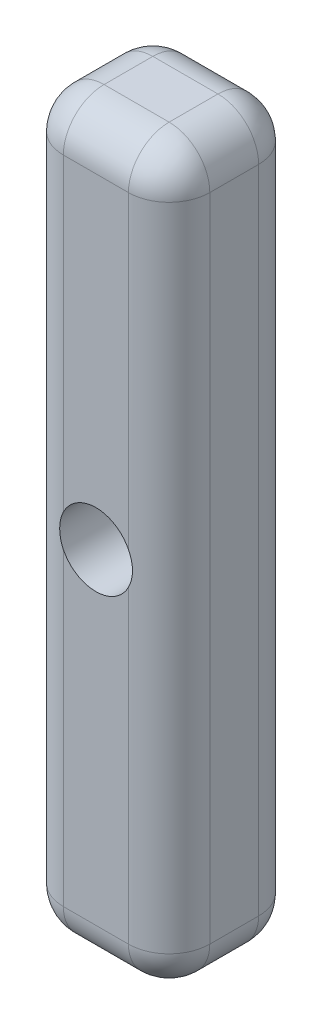
ISO-10303-21;
HEADER;
FILE_DESCRIPTION(('STEP AP214'),'2;1');
FILE_NAME('part.step','',(''),(''),'','','');
FILE_SCHEMA(('AUTOMOTIVE_DESIGN { 1 0 10303 214 1 1 1 1 }'));
ENDSEC;
DATA;
#1=APPLICATION_CONTEXT('core data for automotive mechanical design processes');
#2=APPLICATION_PROTOCOL_DEFINITION('international standard','automotive_design',2000,#1);
#3=PRODUCT_CONTEXT('',#1,'mechanical');
#4=PRODUCT('Part','Part','',(#3));
#5=PRODUCT_RELATED_PRODUCT_CATEGORY('part','',(#4));
#6=PRODUCT_DEFINITION_FORMATION('','',#4);
#7=PRODUCT_DEFINITION_CONTEXT('part definition',#1,'design');
#8=PRODUCT_DEFINITION('design','',#6,#7);
#9=PRODUCT_DEFINITION_SHAPE('','',#8);
#10=(LENGTH_UNIT() NAMED_UNIT(*) SI_UNIT(.MILLI.,.METRE.));
#11=(NAMED_UNIT(*) PLANE_ANGLE_UNIT() SI_UNIT($,.RADIAN.));
#12=(NAMED_UNIT(*) SI_UNIT($,.STERADIAN.) SOLID_ANGLE_UNIT());
#13=UNCERTAINTY_MEASURE_WITH_UNIT(LENGTH_MEASURE(1.E-05),#10,'distance_accuracy_value','');
#14=(GEOMETRIC_REPRESENTATION_CONTEXT(3) GLOBAL_UNCERTAINTY_ASSIGNED_CONTEXT((#13)) GLOBAL_UNIT_ASSIGNED_CONTEXT((#10,
#11,#12)) REPRESENTATION_CONTEXT('',''));
#15=CARTESIAN_POINT('',(0.,0.,0.));
#16=DIRECTION('',(0.,0.,1.));
#17=DIRECTION('',(1.,0.,0.));
#18=AXIS2_PLACEMENT_3D('',#15,#16,#17);
#19=CARTESIAN_POINT('',(0.,0.,16.));
#20=DIRECTION('',(0.,0.,-1.));
#21=DIRECTION('',(-1.,0.,0.));
#22=AXIS2_PLACEMENT_3D('',#19,#20,#21);
#23=PLANE('',#22);
#24=DIRECTION('',(-1.,0.,0.));
#25=VECTOR('',#24,1.);
#26=CARTESIAN_POINT('',(0.,40.,16.));
#27=LINE('',#26,#25);
#28=CARTESIAN_POINT('',(4.,40.,16.));
#29=VERTEX_POINT('',#28);
#30=CARTESIAN_POINT('',(-4.,40.,16.));
#31=VERTEX_POINT('',#30);
#32=EDGE_CURVE('E166',#29,#31,#27,.T.);
#33=ORIENTED_EDGE('',*,*,#32,.T.);
#34=DIRECTION('',(0.,-1.,0.));
#35=VECTOR('',#34,1.);
#36=CARTESIAN_POINT('',(-4.,0.,16.));
#37=LINE('',#36,#35);
#38=CARTESIAN_POINT('',(-4.,2.00639602272334,16.));
#39=VERTEX_POINT('',#38);
#40=EDGE_CURVE('E154',#31,#39,#37,.T.);
#41=ORIENTED_EDGE('',*,*,#40,.T.);
#42=CARTESIAN_POINT('',(0.,0.,16.));
#43=DIRECTION('',(0.,0.,1.));
#44=DIRECTION('',(1.,0.,0.));
#45=AXIS2_PLACEMENT_3D('',#42,#43,#44);
#46=CIRCLE('',#45,4.475);
#47=CARTESIAN_POINT('',(4.,2.00639602272333,16.));
#48=VERTEX_POINT('',#47);
#49=EDGE_CURVE('E148',#48,#39,#46,.T.);
#50=ORIENTED_EDGE('',*,*,#49,.F.);
#51=DIRECTION('',(0.,1.,0.));
#52=VECTOR('',#51,1.);
#53=CARTESIAN_POINT('',(4.,0.,16.));
#54=LINE('',#53,#52);
#55=EDGE_CURVE('E160',#48,#29,#54,.T.);
#56=ORIENTED_EDGE('',*,*,#55,.T.);
#57=EDGE_LOOP('',(#33,#41,#50,#56));
#58=FACE_BOUND('',#57,.T.);
#59=ADVANCED_FACE('F41',(#58),#23,.F.);
#60=CARTESIAN_POINT('',(9.,45.,16.));
#61=DIRECTION('',(0.,-1.,0.));
#62=DIRECTION('',(0.,0.,-1.));
#63=AXIS2_PLACEMENT_3D('',#60,#61,#62);
#64=PLANE('',#63);
#65=DIRECTION('',(-1.,0.,0.));
#66=VECTOR('',#65,1.);
#67=CARTESIAN_POINT('',(9.,45.,11.));
#68=LINE('',#67,#66);
#69=CARTESIAN_POINT('',(-4.,45.,11.));
#70=VERTEX_POINT('',#69);
#71=CARTESIAN_POINT('',(4.,45.,11.));
#72=VERTEX_POINT('',#71);
#73=EDGE_CURVE('E474',#70,#72,#68,.F.);
#74=ORIENTED_EDGE('',*,*,#73,.T.);
#75=DIRECTION('',(0.,0.,-1.));
#76=VECTOR('',#75,1.);
#77=CARTESIAN_POINT('',(4.,45.,16.));
#78=LINE('',#77,#76);
#79=CARTESIAN_POINT('',(4.,45.,5.));
#80=VERTEX_POINT('',#79);
#81=EDGE_CURVE('E464',#72,#80,#78,.T.);
#82=ORIENTED_EDGE('',*,*,#81,.T.);
#83=DIRECTION('',(-1.,0.,0.));
#84=VECTOR('',#83,1.);
#85=CARTESIAN_POINT('',(-9.,45.,5.));
#86=LINE('',#85,#84);
#87=CARTESIAN_POINT('',(-4.,45.,5.));
#88=VERTEX_POINT('',#87);
#89=EDGE_CURVE('E473',#80,#88,#86,.T.);
#90=ORIENTED_EDGE('',*,*,#89,.T.);
#91=DIRECTION('',(0.,0.,-1.));
#92=VECTOR('',#91,1.);
#93=CARTESIAN_POINT('',(-4.,45.,16.));
#94=LINE('',#93,#92);
#95=EDGE_CURVE('E476',#88,#70,#94,.F.);
#96=ORIENTED_EDGE('',*,*,#95,.T.);
#97=EDGE_LOOP('',(#74,#82,#90,#96));
#98=FACE_BOUND('',#97,.T.);
#99=ADVANCED_FACE('F212',(#98),#64,.F.);
#100=CARTESIAN_POINT('',(-9.,-45.,16.));
#101=DIRECTION('',(1.,0.,0.));
#102=DIRECTION('',(0.,0.,-1.));
#103=AXIS2_PLACEMENT_3D('',#100,#101,#102);
#104=PLANE('',#103);
#105=DIRECTION('',(0.,0.,-1.));
#106=VECTOR('',#105,1.);
#107=CARTESIAN_POINT('',(-9.,-40.,16.));
#108=LINE('',#107,#106);
#109=CARTESIAN_POINT('',(-9.,-40.,5.));
#110=VERTEX_POINT('',#109);
#111=CARTESIAN_POINT('',(-9.,-40.,11.));
#112=VERTEX_POINT('',#111);
#113=EDGE_CURVE('E582',#110,#112,#108,.F.);
#114=ORIENTED_EDGE('',*,*,#113,.T.);
#115=DIRECTION('',(0.,-1.,0.));
#116=VECTOR('',#115,1.);
#117=CARTESIAN_POINT('',(-9.,-45.,11.));
#118=LINE('',#117,#116);
#119=CARTESIAN_POINT('',(-9.,40.,11.));
#120=VERTEX_POINT('',#119);
#121=EDGE_CURVE('E562',#112,#120,#118,.F.);
#122=ORIENTED_EDGE('',*,*,#121,.T.);
#123=DIRECTION('',(0.,0.,-1.));
#124=VECTOR('',#123,1.);
#125=CARTESIAN_POINT('',(-9.,40.,16.));
#126=LINE('',#125,#124);
#127=CARTESIAN_POINT('',(-9.,40.,5.));
#128=VERTEX_POINT('',#127);
#129=EDGE_CURVE('E570',#120,#128,#126,.T.);
#130=ORIENTED_EDGE('',*,*,#129,.T.);
#131=DIRECTION('',(0.,-1.,0.));
#132=VECTOR('',#131,1.);
#133=CARTESIAN_POINT('',(-9.,-45.,5.));
#134=LINE('',#133,#132);
#135=EDGE_CURVE('E571',#128,#110,#134,.T.);
#136=ORIENTED_EDGE('',*,*,#135,.T.);
#137=EDGE_LOOP('',(#114,#122,#130,#136));
#138=FACE_BOUND('',#137,.T.);
#139=ADVANCED_FACE('F215',(#138),#104,.F.);
#140=CARTESIAN_POINT('',(9.,-45.,16.));
#141=DIRECTION('',(0.,1.,0.));
#142=DIRECTION('',(0.,0.,1.));
#143=AXIS2_PLACEMENT_3D('',#140,#141,#142);
#144=PLANE('',#143);
#145=DIRECTION('',(1.,0.,0.));
#146=VECTOR('',#145,1.);
#147=CARTESIAN_POINT('',(9.,-45.,11.));
#148=LINE('',#147,#146);
#149=CARTESIAN_POINT('',(4.,-45.,11.));
#150=VERTEX_POINT('',#149);
#151=CARTESIAN_POINT('',(-4.,-45.,11.));
#152=VERTEX_POINT('',#151);
#153=EDGE_CURVE('E49',#150,#152,#148,.F.);
#154=ORIENTED_EDGE('',*,*,#153,.T.);
#155=DIRECTION('',(0.,0.,-1.));
#156=VECTOR('',#155,1.);
#157=CARTESIAN_POINT('',(-4.,-45.,16.));
#158=LINE('',#157,#156);
#159=CARTESIAN_POINT('',(-4.,-45.,5.));
#160=VERTEX_POINT('',#159);
#161=EDGE_CURVE('E11',#152,#160,#158,.T.);
#162=ORIENTED_EDGE('',*,*,#161,.T.);
#163=DIRECTION('',(1.,0.,0.));
#164=VECTOR('',#163,1.);
#165=CARTESIAN_POINT('',(9.,-45.,5.));
#166=LINE('',#165,#164);
#167=CARTESIAN_POINT('',(4.,-45.,5.));
#168=VERTEX_POINT('',#167);
#169=EDGE_CURVE('E490',#160,#168,#166,.T.);
#170=ORIENTED_EDGE('',*,*,#169,.T.);
#171=DIRECTION('',(0.,0.,-1.));
#172=VECTOR('',#171,1.);
#173=CARTESIAN_POINT('',(4.,-45.,16.));
#174=LINE('',#173,#172);
#175=EDGE_CURVE('E63',#168,#150,#174,.F.);
#176=ORIENTED_EDGE('',*,*,#175,.T.);
#177=EDGE_LOOP('',(#154,#162,#170,#176));
#178=FACE_BOUND('',#177,.T.);
#179=ADVANCED_FACE('F206',(#178),#144,.F.);
#180=CARTESIAN_POINT('',(9.,-45.,16.));
#181=DIRECTION('',(-1.,0.,0.));
#182=DIRECTION('',(0.,0.,1.));
#183=AXIS2_PLACEMENT_3D('',#180,#181,#182);
#184=PLANE('',#183);
#185=DIRECTION('',(0.,0.,-1.));
#186=VECTOR('',#185,1.);
#187=CARTESIAN_POINT('',(9.,40.,16.));
#188=LINE('',#187,#186);
#189=CARTESIAN_POINT('',(9.,40.,5.));
#190=VERTEX_POINT('',#189);
#191=CARTESIAN_POINT('',(9.,40.,11.));
#192=VERTEX_POINT('',#191);
#193=EDGE_CURVE('E463',#190,#192,#188,.F.);
#194=ORIENTED_EDGE('',*,*,#193,.T.);
#195=DIRECTION('',(0.,1.,0.));
#196=VECTOR('',#195,1.);
#197=CARTESIAN_POINT('',(9.,-45.,11.));
#198=LINE('',#197,#196);
#199=CARTESIAN_POINT('',(9.,-40.,11.));
#200=VERTEX_POINT('',#199);
#201=EDGE_CURVE('E580',#192,#200,#198,.F.);
#202=ORIENTED_EDGE('',*,*,#201,.T.);
#203=DIRECTION('',(0.,0.,-1.));
#204=VECTOR('',#203,1.);
#205=CARTESIAN_POINT('',(9.,-40.,16.));
#206=LINE('',#205,#204);
#207=CARTESIAN_POINT('',(9.,-40.,5.));
#208=VERTEX_POINT('',#207);
#209=EDGE_CURVE('E566',#200,#208,#206,.T.);
#210=ORIENTED_EDGE('',*,*,#209,.T.);
#211=DIRECTION('',(0.,1.,0.));
#212=VECTOR('',#211,1.);
#213=CARTESIAN_POINT('',(9.,45.,5.));
#214=LINE('',#213,#212);
#215=EDGE_CURVE('E567',#208,#190,#214,.T.);
#216=ORIENTED_EDGE('',*,*,#215,.T.);
#217=EDGE_LOOP('',(#194,#202,#210,#216));
#218=FACE_BOUND('',#217,.T.);
#219=ADVANCED_FACE('F202',(#218),#184,.F.);
#220=CARTESIAN_POINT('',(-4.,-2.00639602272334,16.));
#221=VERTEX_POINT('',#220);
#222=CARTESIAN_POINT('',(4.,-2.00639602272333,16.));
#223=VERTEX_POINT('',#222);
#224=EDGE_CURVE('E146',#221,#223,#46,.T.);
#225=ORIENTED_EDGE('',*,*,#224,.F.);
#226=DIRECTION('',(0.,-1.,0.));
#227=VECTOR('',#226,1.);
#228=CARTESIAN_POINT('',(-4.,0.,16.));
#229=LINE('',#228,#227);
#230=CARTESIAN_POINT('',(-4.,-40.,16.));
#231=VERTEX_POINT('',#230);
#232=EDGE_CURVE('E171',#221,#231,#229,.T.);
#233=ORIENTED_EDGE('',*,*,#232,.T.);
#234=DIRECTION('',(1.,0.,0.));
#235=VECTOR('',#234,1.);
#236=CARTESIAN_POINT('',(0.,-40.,16.));
#237=LINE('',#236,#235);
#238=CARTESIAN_POINT('',(4.,-40.,16.));
#239=VERTEX_POINT('',#238);
#240=EDGE_CURVE('E551',#231,#239,#237,.T.);
#241=ORIENTED_EDGE('',*,*,#240,.T.);
#242=DIRECTION('',(0.,1.,0.));
#243=VECTOR('',#242,1.);
#244=CARTESIAN_POINT('',(4.,0.,16.));
#245=LINE('',#244,#243);
#246=EDGE_CURVE('E554',#239,#223,#245,.T.);
#247=ORIENTED_EDGE('',*,*,#246,.T.);
#248=EDGE_LOOP('',(#225,#233,#241,#247));
#249=FACE_BOUND('',#248,.T.);
#250=ADVANCED_FACE('F200',(#249),#23,.F.);
#251=CARTESIAN_POINT('',(0.,0.,0.));
#252=DIRECTION('',(0.,0.,-1.));
#253=DIRECTION('',(-1.,0.,0.));
#254=AXIS2_PLACEMENT_3D('',#251,#252,#253);
#255=PLANE('',#254);
#256=DIRECTION('',(0.,-1.,0.));
#257=VECTOR('',#256,1.);
#258=CARTESIAN_POINT('',(-4.,45.,0.));
#259=LINE('',#258,#257);
#260=CARTESIAN_POINT('',(-4.,-40.,0.));
#261=VERTEX_POINT('',#260);
#262=CARTESIAN_POINT('',(-4.,40.,0.));
#263=VERTEX_POINT('',#262);
#264=EDGE_CURVE('E481',#261,#263,#259,.F.);
#265=ORIENTED_EDGE('',*,*,#264,.T.);
#266=DIRECTION('',(-1.,0.,0.));
#267=VECTOR('',#266,1.);
#268=CARTESIAN_POINT('',(9.,40.,0.));
#269=LINE('',#268,#267);
#270=CARTESIAN_POINT('',(4.,40.,0.));
#271=VERTEX_POINT('',#270);
#272=EDGE_CURVE('E487',#263,#271,#269,.F.);
#273=ORIENTED_EDGE('',*,*,#272,.T.);
#274=DIRECTION('',(0.,1.,0.));
#275=VECTOR('',#274,1.);
#276=CARTESIAN_POINT('',(4.,-45.,0.));
#277=LINE('',#276,#275);
#278=CARTESIAN_POINT('',(4.,-40.,0.));
#279=VERTEX_POINT('',#278);
#280=EDGE_CURVE('E480',#271,#279,#277,.F.);
#281=ORIENTED_EDGE('',*,*,#280,.T.);
#282=DIRECTION('',(1.,0.,0.));
#283=VECTOR('',#282,1.);
#284=CARTESIAN_POINT('',(-9.,-40.,0.));
#285=LINE('',#284,#283);
#286=EDGE_CURVE('E472',#279,#261,#285,.F.);
#287=ORIENTED_EDGE('',*,*,#286,.T.);
#288=EDGE_LOOP('',(#265,#273,#281,#287));
#289=FACE_BOUND('',#288,.T.);
#290=ADVANCED_FACE('F192',(#289),#255,.T.);
#291=CARTESIAN_POINT('',(0.,0.,3.3));
#292=DIRECTION('',(0.,0.,1.));
#293=DIRECTION('',(1.,0.,0.));
#294=AXIS2_PLACEMENT_3D('',#291,#292,#293);
#295=CYLINDRICAL_SURFACE('',#294,4.475);
#296=CARTESIAN_POINT('',(0.,0.,3.3));
#297=DIRECTION('',(0.,0.,1.));
#298=DIRECTION('',(1.,0.,0.));
#299=AXIS2_PLACEMENT_3D('',#296,#297,#298);
#300=CIRCLE('',#299,4.475);
#301=CARTESIAN_POINT('',(4.475,0.,3.3));
#302=VERTEX_POINT('',#301);
#303=EDGE_CURVE('E158',#302,#302,#300,.T.);
#304=ORIENTED_EDGE('',*,*,#303,.F.);
#305=EDGE_LOOP('',(#304));
#306=FACE_BOUND('',#305,.T.);
#307=ORIENTED_EDGE('',*,*,#49,.T.);
#308=CARTESIAN_POINT('',(-4.,2.00639602272334,16.));
#309=CARTESIAN_POINT('',(-4.05639728681269,1.89399038176476,15.9999751909253));
#310=CARTESIAN_POINT('',(-4.10802835517569,1.77920538537928,15.9990445828598));
#311=CARTESIAN_POINT('',(-4.20144793817522,1.5457162278286,15.9961654923754));
#312=CARTESIAN_POINT('',(-4.24323702026239,1.42701229306429,15.9942170686607));
#313=CARTESIAN_POINT('',(-4.31663393655196,1.18662677928175,15.9900978574479));
#314=CARTESIAN_POINT('',(-4.34825148029835,1.064948159968,15.9879272846341));
#315=CARTESIAN_POINT('',(-4.40114184862142,0.819359770278402,15.983953663564));
#316=CARTESIAN_POINT('',(-4.42241493262628,0.695450055936901,15.9821506060914));
#317=CARTESIAN_POINT('',(-4.45447755730899,0.446162721476656,15.9793281777453));
#318=CARTESIAN_POINT('',(-4.4652580280109,0.320783926024703,15.9783094850474));
#319=CARTESIAN_POINT('',(-4.47622571658609,0.0695600826896412,15.9772722841938));
#320=CARTESIAN_POINT('',(-4.47641284088471,-0.0562849693022512,15.9772537848731));
#321=CARTESIAN_POINT('',(-4.46619162977098,-0.307480465776451,15.978221935045));
#322=CARTESIAN_POINT('',(-4.45578885489134,-0.432831135172136,15.9792080570324));
#323=CARTESIAN_POINT('',(-4.42448697302121,-0.682158198945725,15.9819723183656));
#324=CARTESIAN_POINT('',(-4.40358959812081,-0.806134816655175,15.9837503270083));
#325=CARTESIAN_POINT('',(-4.33788403724872,-1.11567102962808,15.9887335535802));
#326=CARTESIAN_POINT('',(-4.28629690654538,-1.2998525039807,15.9922009077931));
#327=CARTESIAN_POINT('',(-4.1916793885092,-1.56989636891457,15.996421839261));
#328=CARTESIAN_POINT('',(-4.15726571604157,-1.65887631709816,15.9976654961414));
#329=CARTESIAN_POINT('',(-4.08281631112458,-1.83448140597862,15.9994521193985));
#330=CARTESIAN_POINT('',(-4.04277938564264,-1.92110604230406,15.999994936835));
#331=CARTESIAN_POINT('',(-4.,-2.00639602272334,16.));
#332=B_SPLINE_CURVE_WITH_KNOTS('',3,(#308,#309,#310,#311,#312,#313,#314,#315,#316,#317,#318,
#319,#320,#321,#322,#323,#324,#325,#326,#327,#328,#329,#330,#331),.UNSPECIFIED.,.F.,.F.,(4,2,2,
2,2,2,2,2,2,2,2,4),(0.,0.377152217937876,0.754282685420198,1.13105207618023,1.50781201747219,
1.88489734735669,2.26198600816473,2.63887676974772,3.01570534751076,3.58779987621884,
3.87386969184339,4.16000029214202),.UNSPECIFIED.);
#333=EDGE_CURVE('E155',#39,#221,#332,.T.);
#334=ORIENTED_EDGE('',*,*,#333,.T.);
#335=ORIENTED_EDGE('',*,*,#224,.T.);
#336=CARTESIAN_POINT('',(4.,-2.00639602272333,16.));
#337=CARTESIAN_POINT('',(4.05639728681269,-1.89399038176475,15.9999751909253));
#338=CARTESIAN_POINT('',(4.10802835517569,-1.77920538537928,15.9990445828598));
#339=CARTESIAN_POINT('',(4.20144793817522,-1.5457162278286,15.9961654923754));
#340=CARTESIAN_POINT('',(4.24323702026239,-1.42701229306428,15.9942170686607));
#341=CARTESIAN_POINT('',(4.31663393655196,-1.18662677928175,15.9900978574479));
#342=CARTESIAN_POINT('',(4.34825148029835,-1.064948159968,15.9879272846341));
#343=CARTESIAN_POINT('',(4.40114184862142,-0.819359770278399,15.983953663564));
#344=CARTESIAN_POINT('',(4.42241493262628,-0.695450055936897,15.9821506060914));
#345=CARTESIAN_POINT('',(4.45447755730899,-0.446162721476651,15.9793281777453));
#346=CARTESIAN_POINT('',(4.4652580280109,-0.320783926024698,15.9783094850474));
#347=CARTESIAN_POINT('',(4.47622571658609,-0.069560082689637,15.9772722841938));
#348=CARTESIAN_POINT('',(4.47641284088471,0.0562849693022555,15.9772537848731));
#349=CARTESIAN_POINT('',(4.46619162977098,0.307480465776456,15.978221935045));
#350=CARTESIAN_POINT('',(4.45578885489134,0.43283113517214,15.9792080570324));
#351=CARTESIAN_POINT('',(4.42448697302121,0.682158198945729,15.9819723183656));
#352=CARTESIAN_POINT('',(4.40358959812081,0.806134816655179,15.9837503270084));
#353=CARTESIAN_POINT('',(4.33788403724872,1.11567102962809,15.9887335535803));
#354=CARTESIAN_POINT('',(4.28629690654538,1.2998525039807,15.9922009077931));
#355=CARTESIAN_POINT('',(4.1916793885092,1.56989636891457,15.996421839261));
#356=CARTESIAN_POINT('',(4.15726571604157,1.65887631709816,15.9976654961414));
#357=CARTESIAN_POINT('',(4.08281631112458,1.83448140597862,15.9994521193985));
#358=CARTESIAN_POINT('',(4.04277938564264,1.92110604230406,15.999994936835));
#359=CARTESIAN_POINT('',(4.,2.00639602272333,16.));
#360=B_SPLINE_CURVE_WITH_KNOTS('',3,(#336,#337,#338,#339,#340,#341,#342,#343,#344,#345,#346,
#347,#348,#349,#350,#351,#352,#353,#354,#355,#356,#357,#358,#359),.UNSPECIFIED.,.F.,.F.,(4,2,2,
2,2,2,2,2,2,2,2,4),(0.,0.377152217937876,0.754282685420198,1.13105207618023,1.50781201747219,
1.88489734735669,2.26198600816473,2.63887676974772,3.01570534751076,3.58779987621883,
3.87386969184338,4.16000029214201),.UNSPECIFIED.);
#361=EDGE_CURVE('E141',#223,#48,#360,.T.);
#362=ORIENTED_EDGE('',*,*,#361,.T.);
#363=EDGE_LOOP('',(#307,#334,#335,#362));
#364=FACE_BOUND('',#363,.T.);
#365=ADVANCED_FACE('F143',(#306,#364),#295,.F.);
#366=CARTESIAN_POINT('',(0.,0.,3.3));
#367=DIRECTION('',(0.,0.,1.));
#368=DIRECTION('',(1.,0.,0.));
#369=AXIS2_PLACEMENT_3D('',#366,#367,#368);
#370=PLANE('',#369);
#371=ORIENTED_EDGE('',*,*,#303,.T.);
#372=EDGE_LOOP('',(#371));
#373=FACE_BOUND('',#372,.T.);
#374=ADVANCED_FACE('F194',(#373),#370,.T.);
#375=CARTESIAN_POINT('',(4.,-45.,5.));
#376=DIRECTION('',(0.,-1.,0.));
#377=DIRECTION('',(0.,0.,-1.));
#378=AXIS2_PLACEMENT_3D('',#375,#376,#377);
#379=CYLINDRICAL_SURFACE('',#378,5.);
#380=CARTESIAN_POINT('',(4.,40.,5.));
#381=DIRECTION('',(0.,1.,0.));
#382=DIRECTION('',(0.,0.,1.));
#383=AXIS2_PLACEMENT_3D('',#380,#381,#382);
#384=CIRCLE('',#383,5.);
#385=EDGE_CURVE('E44',#190,#271,#384,.T.);
#386=ORIENTED_EDGE('',*,*,#385,.F.);
#387=ORIENTED_EDGE('',*,*,#215,.F.);
#388=CARTESIAN_POINT('',(4.,-40.,5.));
#389=DIRECTION('',(0.,-1.,0.));
#390=DIRECTION('',(0.,0.,-1.));
#391=AXIS2_PLACEMENT_3D('',#388,#389,#390);
#392=CIRCLE('',#391,5.);
#393=EDGE_CURVE('E543',#279,#208,#392,.T.);
#394=ORIENTED_EDGE('',*,*,#393,.F.);
#395=ORIENTED_EDGE('',*,*,#280,.F.);
#396=EDGE_LOOP('',(#386,#387,#394,#395));
#397=FACE_BOUND('',#396,.T.);
#398=ADVANCED_FACE('F43',(#397),#379,.T.);
#399=CARTESIAN_POINT('',(4.,40.,5.));
#400=DIRECTION('',(0.,0.,-1.));
#401=DIRECTION('',(-1.,0.,0.));
#402=AXIS2_PLACEMENT_3D('',#399,#400,#401);
#403=SPHERICAL_SURFACE('',#402,5.);
#404=CARTESIAN_POINT('',(4.,40.,5.));
#405=DIRECTION('',(0.,0.,-1.));
#406=DIRECTION('',(-1.,0.,0.));
#407=AXIS2_PLACEMENT_3D('',#404,#405,#406);
#408=CIRCLE('',#407,5.);
#409=EDGE_CURVE('E458',#190,#80,#408,.F.);
#410=ORIENTED_EDGE('',*,*,#409,.F.);
#411=ORIENTED_EDGE('',*,*,#385,.T.);
#412=CARTESIAN_POINT('',(4.,40.,5.));
#413=DIRECTION('',(1.,0.,0.));
#414=DIRECTION('',(0.,0.,-1.));
#415=AXIS2_PLACEMENT_3D('',#412,#413,#414);
#416=CIRCLE('',#415,5.);
#417=EDGE_CURVE('E466',#80,#271,#416,.F.);
#418=ORIENTED_EDGE('',*,*,#417,.F.);
#419=EDGE_LOOP('',(#410,#411,#418));
#420=FACE_BOUND('',#419,.T.);
#421=ADVANCED_FACE('F329',(#420),#403,.T.);
#422=CARTESIAN_POINT('',(4.,-40.,5.));
#423=DIRECTION('',(1.,0.,0.));
#424=DIRECTION('',(0.,0.,-1.));
#425=AXIS2_PLACEMENT_3D('',#422,#423,#424);
#426=SPHERICAL_SURFACE('',#425,5.);
#427=CARTESIAN_POINT('',(4.,-40.,5.));
#428=DIRECTION('',(1.,0.,0.));
#429=DIRECTION('',(0.,0.,-1.));
#430=AXIS2_PLACEMENT_3D('',#427,#428,#429);
#431=CIRCLE('',#430,5.);
#432=EDGE_CURVE('E537',#279,#168,#431,.F.);
#433=ORIENTED_EDGE('',*,*,#432,.F.);
#434=ORIENTED_EDGE('',*,*,#393,.T.);
#435=CARTESIAN_POINT('',(4.,-40.,5.));
#436=DIRECTION('',(0.,0.,-1.));
#437=DIRECTION('',(-1.,0.,0.));
#438=AXIS2_PLACEMENT_3D('',#435,#436,#437);
#439=CIRCLE('',#438,5.);
#440=EDGE_CURVE('E469',#168,#208,#439,.F.);
#441=ORIENTED_EDGE('',*,*,#440,.F.);
#442=EDGE_LOOP('',(#433,#434,#441));
#443=FACE_BOUND('',#442,.T.);
#444=ADVANCED_FACE('F333',(#443),#426,.T.);
#445=CARTESIAN_POINT('',(9.,40.,5.));
#446=DIRECTION('',(1.,0.,0.));
#447=DIRECTION('',(0.,0.,-1.));
#448=AXIS2_PLACEMENT_3D('',#445,#446,#447);
#449=CYLINDRICAL_SURFACE('',#448,5.);
#450=ORIENTED_EDGE('',*,*,#417,.T.);
#451=ORIENTED_EDGE('',*,*,#272,.F.);
#452=CARTESIAN_POINT('',(-4.,40.,5.));
#453=DIRECTION('',(-1.,0.,0.));
#454=DIRECTION('',(0.,0.,1.));
#455=AXIS2_PLACEMENT_3D('',#452,#453,#454);
#456=CIRCLE('',#455,5.);
#457=EDGE_CURVE('E533',#88,#263,#456,.T.);
#458=ORIENTED_EDGE('',*,*,#457,.F.);
#459=ORIENTED_EDGE('',*,*,#89,.F.);
#460=EDGE_LOOP('',(#450,#451,#458,#459));
#461=FACE_BOUND('',#460,.T.);
#462=ADVANCED_FACE('F341',(#461),#449,.T.);
#463=CARTESIAN_POINT('',(4.,40.,16.));
#464=DIRECTION('',(0.,0.,-1.));
#465=DIRECTION('',(-1.,0.,0.));
#466=AXIS2_PLACEMENT_3D('',#463,#464,#465);
#467=CYLINDRICAL_SURFACE('',#466,5.);
#468=ORIENTED_EDGE('',*,*,#409,.T.);
#469=ORIENTED_EDGE('',*,*,#81,.F.);
#470=CARTESIAN_POINT('',(4.,40.,11.));
#471=DIRECTION('',(0.,0.,1.));
#472=DIRECTION('',(1.,0.,0.));
#473=AXIS2_PLACEMENT_3D('',#470,#471,#472);
#474=CIRCLE('',#473,5.);
#475=EDGE_CURVE('E531',#192,#72,#474,.T.);
#476=ORIENTED_EDGE('',*,*,#475,.F.);
#477=ORIENTED_EDGE('',*,*,#193,.F.);
#478=EDGE_LOOP('',(#468,#469,#476,#477));
#479=FACE_BOUND('',#478,.T.);
#480=ADVANCED_FACE('F280',(#479),#467,.T.);
#481=CARTESIAN_POINT('',(4.,0.,11.));
#482=DIRECTION('',(0.,1.,0.));
#483=DIRECTION('',(0.,0.,1.));
#484=AXIS2_PLACEMENT_3D('',#481,#482,#483);
#485=CYLINDRICAL_SURFACE('',#484,5.);
#486=CARTESIAN_POINT('',(4.,-40.,11.));
#487=DIRECTION('',(0.,-1.,0.));
#488=DIRECTION('',(0.,0.,-1.));
#489=AXIS2_PLACEMENT_3D('',#486,#487,#488);
#490=CIRCLE('',#489,5.);
#491=EDGE_CURVE('E526',#200,#239,#490,.T.);
#492=ORIENTED_EDGE('',*,*,#491,.F.);
#493=ORIENTED_EDGE('',*,*,#201,.F.);
#494=CARTESIAN_POINT('',(4.,40.,11.));
#495=DIRECTION('',(0.,1.,0.));
#496=DIRECTION('',(0.,0.,1.));
#497=AXIS2_PLACEMENT_3D('',#494,#495,#496);
#498=CIRCLE('',#497,5.);
#499=EDGE_CURVE('E168',#29,#192,#498,.T.);
#500=ORIENTED_EDGE('',*,*,#499,.F.);
#501=ORIENTED_EDGE('',*,*,#55,.F.);
#502=ORIENTED_EDGE('',*,*,#361,.F.);
#503=ORIENTED_EDGE('',*,*,#246,.F.);
#504=EDGE_LOOP('',(#492,#493,#500,#501,#502,#503));
#505=FACE_BOUND('',#504,.T.);
#506=ADVANCED_FACE('F161',(#505),#485,.T.);
#507=CARTESIAN_POINT('',(4.,-40.,16.));
#508=DIRECTION('',(0.,0.,-1.));
#509=DIRECTION('',(-1.,0.,0.));
#510=AXIS2_PLACEMENT_3D('',#507,#508,#509);
#511=CYLINDRICAL_SURFACE('',#510,5.);
#512=ORIENTED_EDGE('',*,*,#440,.T.);
#513=ORIENTED_EDGE('',*,*,#209,.F.);
#514=CARTESIAN_POINT('',(4.,-40.,11.));
#515=DIRECTION('',(0.,0.,1.));
#516=DIRECTION('',(1.,0.,0.));
#517=AXIS2_PLACEMENT_3D('',#514,#515,#516);
#518=CIRCLE('',#517,5.);
#519=EDGE_CURVE('E530',#150,#200,#518,.T.);
#520=ORIENTED_EDGE('',*,*,#519,.F.);
#521=ORIENTED_EDGE('',*,*,#175,.F.);
#522=EDGE_LOOP('',(#512,#513,#520,#521));
#523=FACE_BOUND('',#522,.T.);
#524=ADVANCED_FACE('F268',(#523),#511,.T.);
#525=CARTESIAN_POINT('',(9.,-40.,5.));
#526=DIRECTION('',(-1.,0.,0.));
#527=DIRECTION('',(0.,0.,1.));
#528=AXIS2_PLACEMENT_3D('',#525,#526,#527);
#529=CYLINDRICAL_SURFACE('',#528,5.);
#530=ORIENTED_EDGE('',*,*,#432,.T.);
#531=ORIENTED_EDGE('',*,*,#169,.F.);
#532=CARTESIAN_POINT('',(-4.,-40.,5.));
#533=DIRECTION('',(-1.,0.,0.));
#534=DIRECTION('',(0.,-1.,0.));
#535=AXIS2_PLACEMENT_3D('',#532,#533,#534);
#536=CIRCLE('',#535,5.);
#537=EDGE_CURVE('E521',#261,#160,#536,.T.);
#538=ORIENTED_EDGE('',*,*,#537,.F.);
#539=ORIENTED_EDGE('',*,*,#286,.F.);
#540=EDGE_LOOP('',(#530,#531,#538,#539));
#541=FACE_BOUND('',#540,.T.);
#542=ADVANCED_FACE('F270',(#541),#529,.T.);
#543=CARTESIAN_POINT('',(-4.,-45.,5.));
#544=DIRECTION('',(0.,1.,0.));
#545=DIRECTION('',(0.,0.,1.));
#546=AXIS2_PLACEMENT_3D('',#543,#544,#545);
#547=CYLINDRICAL_SURFACE('',#546,5.);
#548=CARTESIAN_POINT('',(-4.,40.,5.));
#549=DIRECTION('',(0.,1.,0.));
#550=DIRECTION('',(-1.,0.,0.));
#551=AXIS2_PLACEMENT_3D('',#548,#549,#550);
#552=CIRCLE('',#551,5.);
#553=EDGE_CURVE('E540',#263,#128,#552,.T.);
#554=ORIENTED_EDGE('',*,*,#553,.F.);
#555=ORIENTED_EDGE('',*,*,#264,.F.);
#556=CARTESIAN_POINT('',(-4.,-40.,5.));
#557=DIRECTION('',(0.,-1.,0.));
#558=DIRECTION('',(0.,0.,-1.));
#559=AXIS2_PLACEMENT_3D('',#556,#557,#558);
#560=CIRCLE('',#559,5.);
#561=EDGE_CURVE('E522',#110,#261,#560,.T.);
#562=ORIENTED_EDGE('',*,*,#561,.F.);
#563=ORIENTED_EDGE('',*,*,#135,.F.);
#564=EDGE_LOOP('',(#554,#555,#562,#563));
#565=FACE_BOUND('',#564,.T.);
#566=ADVANCED_FACE('F264',(#565),#547,.T.);
#567=CARTESIAN_POINT('',(-4.,40.,5.));
#568=DIRECTION('',(0.,0.,-1.));
#569=DIRECTION('',(-1.,0.,0.));
#570=AXIS2_PLACEMENT_3D('',#567,#568,#569);
#571=SPHERICAL_SURFACE('',#570,5.);
#572=ORIENTED_EDGE('',*,*,#457,.T.);
#573=ORIENTED_EDGE('',*,*,#553,.T.);
#574=CARTESIAN_POINT('',(-4.,40.,5.));
#575=DIRECTION('',(0.,0.,-1.));
#576=DIRECTION('',(-1.,0.,0.));
#577=AXIS2_PLACEMENT_3D('',#574,#575,#576);
#578=CIRCLE('',#577,5.);
#579=EDGE_CURVE('E516',#88,#128,#578,.F.);
#580=ORIENTED_EDGE('',*,*,#579,.F.);
#581=EDGE_LOOP('',(#572,#573,#580));
#582=FACE_BOUND('',#581,.T.);
#583=ADVANCED_FACE('F259',(#582),#571,.T.);
#584=CARTESIAN_POINT('',(4.,40.,11.));
#585=DIRECTION('',(1.,0.,0.));
#586=DIRECTION('',(0.,0.,-1.));
#587=AXIS2_PLACEMENT_3D('',#584,#585,#586);
#588=SPHERICAL_SURFACE('',#587,5.);
#589=ORIENTED_EDGE('',*,*,#499,.T.);
#590=ORIENTED_EDGE('',*,*,#475,.T.);
#591=CARTESIAN_POINT('',(4.,40.,11.));
#592=DIRECTION('',(1.,0.,0.));
#593=DIRECTION('',(0.,0.,-1.));
#594=AXIS2_PLACEMENT_3D('',#591,#592,#593);
#595=CIRCLE('',#594,5.);
#596=EDGE_CURVE('E513',#29,#72,#595,.F.);
#597=ORIENTED_EDGE('',*,*,#596,.F.);
#598=EDGE_LOOP('',(#589,#590,#597));
#599=FACE_BOUND('',#598,.T.);
#600=ADVANCED_FACE('F253',(#599),#588,.T.);
#601=CARTESIAN_POINT('',(4.,-40.,11.));
#602=DIRECTION('',(1.,0.,0.));
#603=DIRECTION('',(0.,0.,-1.));
#604=AXIS2_PLACEMENT_3D('',#601,#602,#603);
#605=SPHERICAL_SURFACE('',#604,5.);
#606=ORIENTED_EDGE('',*,*,#519,.T.);
#607=ORIENTED_EDGE('',*,*,#491,.T.);
#608=CARTESIAN_POINT('',(4.,-40.,11.));
#609=DIRECTION('',(1.,0.,0.));
#610=DIRECTION('',(0.,0.,-1.));
#611=AXIS2_PLACEMENT_3D('',#608,#609,#610);
#612=CIRCLE('',#611,5.);
#613=EDGE_CURVE('E515',#150,#239,#612,.F.);
#614=ORIENTED_EDGE('',*,*,#613,.F.);
#615=EDGE_LOOP('',(#606,#607,#614));
#616=FACE_BOUND('',#615,.T.);
#617=ADVANCED_FACE('F252',(#616),#605,.T.);
#618=CARTESIAN_POINT('',(-4.,-40.,5.));
#619=DIRECTION('',(0.,0.,-1.));
#620=DIRECTION('',(-1.,0.,0.));
#621=AXIS2_PLACEMENT_3D('',#618,#619,#620);
#622=SPHERICAL_SURFACE('',#621,5.);
#623=ORIENTED_EDGE('',*,*,#561,.T.);
#624=ORIENTED_EDGE('',*,*,#537,.T.);
#625=CARTESIAN_POINT('',(-4.,-40.,5.));
#626=DIRECTION('',(0.,0.,-1.));
#627=DIRECTION('',(-1.,0.,0.));
#628=AXIS2_PLACEMENT_3D('',#625,#626,#627);
#629=CIRCLE('',#628,5.);
#630=EDGE_CURVE('E509',#110,#160,#629,.F.);
#631=ORIENTED_EDGE('',*,*,#630,.F.);
#632=EDGE_LOOP('',(#623,#624,#631));
#633=FACE_BOUND('',#632,.T.);
#634=ADVANCED_FACE('F250',(#633),#622,.T.);
#635=CARTESIAN_POINT('',(-4.,40.,16.));
#636=DIRECTION('',(0.,0.,-1.));
#637=DIRECTION('',(-1.,0.,0.));
#638=AXIS2_PLACEMENT_3D('',#635,#636,#637);
#639=CYLINDRICAL_SURFACE('',#638,5.);
#640=ORIENTED_EDGE('',*,*,#579,.T.);
#641=ORIENTED_EDGE('',*,*,#129,.F.);
#642=CARTESIAN_POINT('',(-4.,40.,11.));
#643=DIRECTION('',(0.,0.,1.));
#644=DIRECTION('',(1.,0.,0.));
#645=AXIS2_PLACEMENT_3D('',#642,#643,#644);
#646=CIRCLE('',#645,5.);
#647=EDGE_CURVE('E510',#70,#120,#646,.T.);
#648=ORIENTED_EDGE('',*,*,#647,.F.);
#649=ORIENTED_EDGE('',*,*,#95,.F.);
#650=EDGE_LOOP('',(#640,#641,#648,#649));
#651=FACE_BOUND('',#650,.T.);
#652=ADVANCED_FACE('F243',(#651),#639,.T.);
#653=CARTESIAN_POINT('',(0.,40.,11.));
#654=DIRECTION('',(-1.,0.,0.));
#655=DIRECTION('',(0.,0.,1.));
#656=AXIS2_PLACEMENT_3D('',#653,#654,#655);
#657=CYLINDRICAL_SURFACE('',#656,5.);
#658=ORIENTED_EDGE('',*,*,#596,.T.);
#659=ORIENTED_EDGE('',*,*,#73,.F.);
#660=CARTESIAN_POINT('',(-4.,40.,11.));
#661=DIRECTION('',(-1.,0.,0.));
#662=DIRECTION('',(0.,0.,1.));
#663=AXIS2_PLACEMENT_3D('',#660,#661,#662);
#664=CIRCLE('',#663,5.);
#665=EDGE_CURVE('E502',#31,#70,#664,.T.);
#666=ORIENTED_EDGE('',*,*,#665,.F.);
#667=ORIENTED_EDGE('',*,*,#32,.F.);
#668=EDGE_LOOP('',(#658,#659,#666,#667));
#669=FACE_BOUND('',#668,.T.);
#670=ADVANCED_FACE('F237',(#669),#657,.T.);
#671=CARTESIAN_POINT('',(0.,-40.,11.));
#672=DIRECTION('',(1.,0.,0.));
#673=DIRECTION('',(0.,0.,-1.));
#674=AXIS2_PLACEMENT_3D('',#671,#672,#673);
#675=CYLINDRICAL_SURFACE('',#674,5.);
#676=ORIENTED_EDGE('',*,*,#613,.T.);
#677=ORIENTED_EDGE('',*,*,#240,.F.);
#678=CARTESIAN_POINT('',(-4.,-40.,11.));
#679=DIRECTION('',(-1.,0.,0.));
#680=DIRECTION('',(0.,0.,1.));
#681=AXIS2_PLACEMENT_3D('',#678,#679,#680);
#682=CIRCLE('',#681,5.);
#683=EDGE_CURVE('E501',#152,#231,#682,.T.);
#684=ORIENTED_EDGE('',*,*,#683,.F.);
#685=ORIENTED_EDGE('',*,*,#153,.F.);
#686=EDGE_LOOP('',(#676,#677,#684,#685));
#687=FACE_BOUND('',#686,.T.);
#688=ADVANCED_FACE('F232',(#687),#675,.T.);
#689=CARTESIAN_POINT('',(-4.,-40.,16.));
#690=DIRECTION('',(0.,0.,-1.));
#691=DIRECTION('',(-1.,0.,0.));
#692=AXIS2_PLACEMENT_3D('',#689,#690,#691);
#693=CYLINDRICAL_SURFACE('',#692,5.);
#694=ORIENTED_EDGE('',*,*,#630,.T.);
#695=ORIENTED_EDGE('',*,*,#161,.F.);
#696=CARTESIAN_POINT('',(-4.,-40.,11.));
#697=DIRECTION('',(0.,0.,1.));
#698=DIRECTION('',(1.,0.,0.));
#699=AXIS2_PLACEMENT_3D('',#696,#697,#698);
#700=CIRCLE('',#699,5.);
#701=EDGE_CURVE('E498',#112,#152,#700,.T.);
#702=ORIENTED_EDGE('',*,*,#701,.F.);
#703=ORIENTED_EDGE('',*,*,#113,.F.);
#704=EDGE_LOOP('',(#694,#695,#702,#703));
#705=FACE_BOUND('',#704,.T.);
#706=ADVANCED_FACE('F233',(#705),#693,.T.);
#707=CARTESIAN_POINT('',(-4.,40.,11.));
#708=DIRECTION('',(0.,1.,0.));
#709=DIRECTION('',(0.,0.,1.));
#710=AXIS2_PLACEMENT_3D('',#707,#708,#709);
#711=SPHERICAL_SURFACE('',#710,5.);
#712=ORIENTED_EDGE('',*,*,#665,.T.);
#713=ORIENTED_EDGE('',*,*,#647,.T.);
#714=CARTESIAN_POINT('',(-4.,40.,11.));
#715=DIRECTION('',(0.,1.,0.));
#716=DIRECTION('',(0.,0.,1.));
#717=AXIS2_PLACEMENT_3D('',#714,#715,#716);
#718=CIRCLE('',#717,5.);
#719=EDGE_CURVE('E496',#31,#120,#718,.F.);
#720=ORIENTED_EDGE('',*,*,#719,.F.);
#721=EDGE_LOOP('',(#712,#713,#720));
#722=FACE_BOUND('',#721,.T.);
#723=ADVANCED_FACE('F227',(#722),#711,.T.);
#724=CARTESIAN_POINT('',(-4.,-40.,11.));
#725=DIRECTION('',(0.,-1.,0.));
#726=DIRECTION('',(1.,0.,0.));
#727=AXIS2_PLACEMENT_3D('',#724,#725,#726);
#728=SPHERICAL_SURFACE('',#727,5.);
#729=ORIENTED_EDGE('',*,*,#701,.T.);
#730=ORIENTED_EDGE('',*,*,#683,.T.);
#731=CARTESIAN_POINT('',(-4.,-40.,11.));
#732=DIRECTION('',(0.,-1.,0.));
#733=DIRECTION('',(0.,0.,-1.));
#734=AXIS2_PLACEMENT_3D('',#731,#732,#733);
#735=CIRCLE('',#734,5.);
#736=EDGE_CURVE('E491',#112,#231,#735,.F.);
#737=ORIENTED_EDGE('',*,*,#736,.F.);
#738=EDGE_LOOP('',(#729,#730,#737));
#739=FACE_BOUND('',#738,.T.);
#740=ADVANCED_FACE('F224',(#739),#728,.T.);
#741=CARTESIAN_POINT('',(-4.,0.,11.));
#742=DIRECTION('',(0.,-1.,0.));
#743=DIRECTION('',(0.,0.,-1.));
#744=AXIS2_PLACEMENT_3D('',#741,#742,#743);
#745=CYLINDRICAL_SURFACE('',#744,5.);
#746=ORIENTED_EDGE('',*,*,#719,.T.);
#747=ORIENTED_EDGE('',*,*,#121,.F.);
#748=ORIENTED_EDGE('',*,*,#736,.T.);
#749=ORIENTED_EDGE('',*,*,#232,.F.);
#750=ORIENTED_EDGE('',*,*,#333,.F.);
#751=ORIENTED_EDGE('',*,*,#40,.F.);
#752=EDGE_LOOP('',(#746,#747,#748,#749,#750,#751));
#753=FACE_BOUND('',#752,.T.);
#754=ADVANCED_FACE('F216',(#753),#745,.T.);
#755=CLOSED_SHELL('',(#59,#99,#139,#179,#219,#250,#290,#365,#374,#398,#421,#444,#462,#480,#506,
#524,#542,#566,#583,#600,#617,#634,#652,#670,#688,#706,#723,#740,#754));
#756=MANIFOLD_SOLID_BREP('B2',#755);
#757=ADVANCED_BREP_SHAPE_REPRESENTATION('',(#18,#756),#14);
#758=SHAPE_DEFINITION_REPRESENTATION(#9,#757);
ENDSEC;
END-ISO-10303-21;
